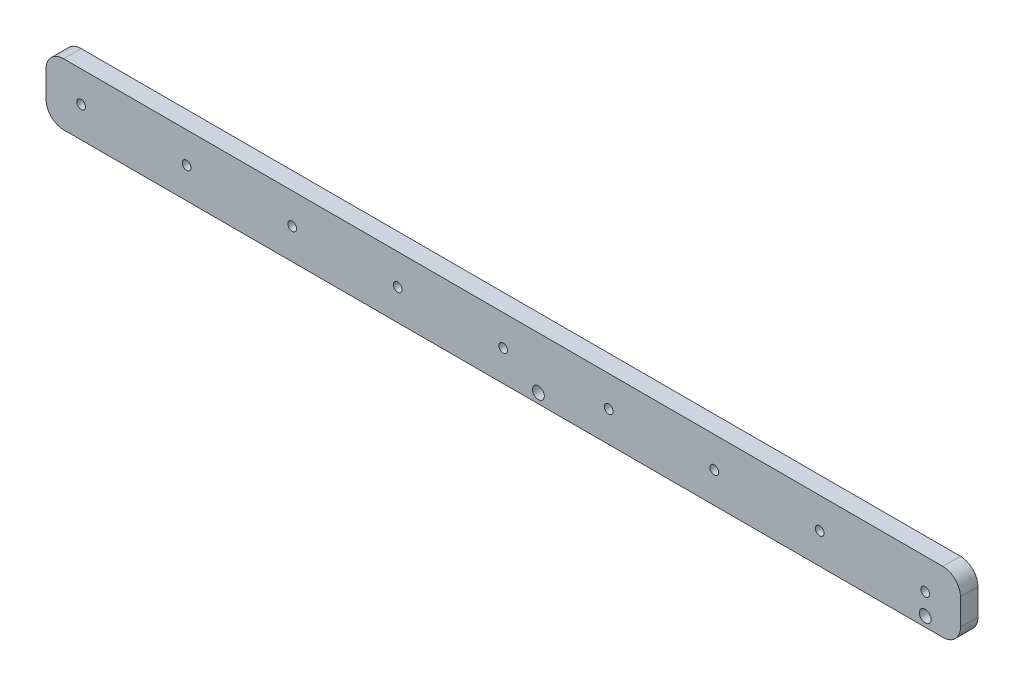
ISO-10303-21;
HEADER;
FILE_DESCRIPTION(('STEP AP214'),'2;1');
FILE_NAME('part.step','',(''),(''),'','','');
FILE_SCHEMA(('AUTOMOTIVE_DESIGN { 1 0 10303 214 1 1 1 1 }'));
ENDSEC;
DATA;
#1=APPLICATION_CONTEXT('core data for automotive mechanical design processes');
#2=APPLICATION_PROTOCOL_DEFINITION('international standard','automotive_design',2000,#1);
#3=PRODUCT_CONTEXT('',#1,'mechanical');
#4=PRODUCT('Part','Part','',(#3));
#5=PRODUCT_RELATED_PRODUCT_CATEGORY('part','',(#4));
#6=PRODUCT_DEFINITION_FORMATION('','',#4);
#7=PRODUCT_DEFINITION_CONTEXT('part definition',#1,'design');
#8=PRODUCT_DEFINITION('design','',#6,#7);
#9=PRODUCT_DEFINITION_SHAPE('','',#8);
#10=(LENGTH_UNIT() NAMED_UNIT(*) SI_UNIT(.MILLI.,.METRE.));
#11=(NAMED_UNIT(*) PLANE_ANGLE_UNIT() SI_UNIT($,.RADIAN.));
#12=(NAMED_UNIT(*) SI_UNIT($,.STERADIAN.) SOLID_ANGLE_UNIT());
#13=UNCERTAINTY_MEASURE_WITH_UNIT(LENGTH_MEASURE(1.E-05),#10,'distance_accuracy_value','');
#14=(GEOMETRIC_REPRESENTATION_CONTEXT(3) GLOBAL_UNCERTAINTY_ASSIGNED_CONTEXT((#13)) GLOBAL_UNIT_ASSIGNED_CONTEXT((#10,
#11,#12)) REPRESENTATION_CONTEXT('',''));
#15=CARTESIAN_POINT('',(0.,0.,0.));
#16=DIRECTION('',(0.,0.,1.));
#17=DIRECTION('',(1.,0.,0.));
#18=AXIS2_PLACEMENT_3D('',#15,#16,#17);
#19=CARTESIAN_POINT('',(240.,0.,10.));
#20=DIRECTION('',(0.,0.,-1.));
#21=DIRECTION('',(-1.,0.,0.));
#22=AXIS2_PLACEMENT_3D('',#19,#20,#21);
#23=CYLINDRICAL_SURFACE('',#22,7.00000000000001);
#24=CARTESIAN_POINT('',(240.,0.,0.));
#25=DIRECTION('',(0.,0.,1.));
#26=DIRECTION('',(1.,0.,0.));
#27=AXIS2_PLACEMENT_3D('',#24,#25,#26);
#28=CIRCLE('',#27,7.00000000000001);
#29=CARTESIAN_POINT('',(247.,0.,0.));
#30=VERTEX_POINT('',#29);
#31=EDGE_CURVE('E203',#30,#30,#28,.T.);
#32=ORIENTED_EDGE('',*,*,#31,.F.);
#33=EDGE_LOOP('',(#32));
#34=FACE_BOUND('',#33,.T.);
#35=CARTESIAN_POINT('',(240.,0.,6.));
#36=DIRECTION('',(0.,0.,1.));
#37=DIRECTION('',(1.,0.,0.));
#38=AXIS2_PLACEMENT_3D('',#35,#36,#37);
#39=CIRCLE('',#38,7.00000000000001);
#40=CARTESIAN_POINT('',(247.,0.,6.));
#41=VERTEX_POINT('',#40);
#42=EDGE_CURVE('E276',#41,#41,#39,.T.);
#43=ORIENTED_EDGE('',*,*,#42,.T.);
#44=EDGE_LOOP('',(#43));
#45=FACE_BOUND('',#44,.T.);
#46=ADVANCED_FACE('F33',(#34,#45),#23,.F.);
#47=CARTESIAN_POINT('',(180.,0.,10.));
#48=DIRECTION('',(0.,0.,-1.));
#49=DIRECTION('',(-1.,0.,0.));
#50=AXIS2_PLACEMENT_3D('',#47,#48,#49);
#51=CYLINDRICAL_SURFACE('',#50,7.00000000000001);
#52=CARTESIAN_POINT('',(180.,0.,0.));
#53=DIRECTION('',(0.,0.,1.));
#54=DIRECTION('',(1.,0.,0.));
#55=AXIS2_PLACEMENT_3D('',#52,#53,#54);
#56=CIRCLE('',#55,7.00000000000001);
#57=CARTESIAN_POINT('',(187.,0.,0.));
#58=VERTEX_POINT('',#57);
#59=EDGE_CURVE('E200',#58,#58,#56,.T.);
#60=ORIENTED_EDGE('',*,*,#59,.F.);
#61=EDGE_LOOP('',(#60));
#62=FACE_BOUND('',#61,.T.);
#63=CARTESIAN_POINT('',(180.,0.,6.));
#64=DIRECTION('',(0.,0.,1.));
#65=DIRECTION('',(1.,0.,0.));
#66=AXIS2_PLACEMENT_3D('',#63,#64,#65);
#67=CIRCLE('',#66,7.00000000000001);
#68=CARTESIAN_POINT('',(187.,0.,6.));
#69=VERTEX_POINT('',#68);
#70=EDGE_CURVE('E267',#69,#69,#67,.T.);
#71=ORIENTED_EDGE('',*,*,#70,.T.);
#72=EDGE_LOOP('',(#71));
#73=FACE_BOUND('',#72,.T.);
#74=ADVANCED_FACE('F327',(#62,#73),#51,.F.);
#75=CARTESIAN_POINT('',(120.,0.,10.));
#76=DIRECTION('',(0.,0.,-1.));
#77=DIRECTION('',(-1.,0.,0.));
#78=AXIS2_PLACEMENT_3D('',#75,#76,#77);
#79=CYLINDRICAL_SURFACE('',#78,7.00000000000001);
#80=CARTESIAN_POINT('',(120.,0.,0.));
#81=DIRECTION('',(0.,0.,1.));
#82=DIRECTION('',(1.,0.,0.));
#83=AXIS2_PLACEMENT_3D('',#80,#81,#82);
#84=CIRCLE('',#83,7.00000000000001);
#85=CARTESIAN_POINT('',(127.,0.,0.));
#86=VERTEX_POINT('',#85);
#87=EDGE_CURVE('E197',#86,#86,#84,.T.);
#88=ORIENTED_EDGE('',*,*,#87,.F.);
#89=EDGE_LOOP('',(#88));
#90=FACE_BOUND('',#89,.T.);
#91=CARTESIAN_POINT('',(120.,0.,6.));
#92=DIRECTION('',(0.,0.,1.));
#93=DIRECTION('',(1.,0.,0.));
#94=AXIS2_PLACEMENT_3D('',#91,#92,#93);
#95=CIRCLE('',#94,7.00000000000001);
#96=CARTESIAN_POINT('',(127.,0.,6.));
#97=VERTEX_POINT('',#96);
#98=EDGE_CURVE('E258',#97,#97,#95,.T.);
#99=ORIENTED_EDGE('',*,*,#98,.T.);
#100=EDGE_LOOP('',(#99));
#101=FACE_BOUND('',#100,.T.);
#102=ADVANCED_FACE('F333',(#90,#101),#79,.F.);
#103=CARTESIAN_POINT('',(60.0000000000001,0.,10.));
#104=DIRECTION('',(0.,0.,-1.));
#105=DIRECTION('',(-1.,0.,0.));
#106=AXIS2_PLACEMENT_3D('',#103,#104,#105);
#107=CYLINDRICAL_SURFACE('',#106,7.);
#108=CARTESIAN_POINT('',(60.0000000000001,0.,0.));
#109=DIRECTION('',(0.,0.,1.));
#110=DIRECTION('',(1.,0.,0.));
#111=AXIS2_PLACEMENT_3D('',#108,#109,#110);
#112=CIRCLE('',#111,7.);
#113=CARTESIAN_POINT('',(67.0000000000001,0.,0.));
#114=VERTEX_POINT('',#113);
#115=EDGE_CURVE('E194',#114,#114,#112,.T.);
#116=ORIENTED_EDGE('',*,*,#115,.F.);
#117=EDGE_LOOP('',(#116));
#118=FACE_BOUND('',#117,.T.);
#119=CARTESIAN_POINT('',(60.0000000000001,0.,6.));
#120=DIRECTION('',(0.,0.,1.));
#121=DIRECTION('',(1.,0.,0.));
#122=AXIS2_PLACEMENT_3D('',#119,#120,#121);
#123=CIRCLE('',#122,7.00000000000002);
#124=CARTESIAN_POINT('',(67.0000000000001,0.,6.));
#125=VERTEX_POINT('',#124);
#126=EDGE_CURVE('E249',#125,#125,#123,.T.);
#127=ORIENTED_EDGE('',*,*,#126,.T.);
#128=EDGE_LOOP('',(#127));
#129=FACE_BOUND('',#128,.T.);
#130=ADVANCED_FACE('F344',(#118,#129),#107,.F.);
#131=CARTESIAN_POINT('',(0.,0.,10.));
#132=DIRECTION('',(0.,0.,-1.));
#133=DIRECTION('',(-1.,0.,0.));
#134=AXIS2_PLACEMENT_3D('',#131,#132,#133);
#135=CYLINDRICAL_SURFACE('',#134,7.);
#136=CARTESIAN_POINT('',(0.,0.,0.));
#137=DIRECTION('',(0.,0.,1.));
#138=DIRECTION('',(1.,0.,0.));
#139=AXIS2_PLACEMENT_3D('',#136,#137,#138);
#140=CIRCLE('',#139,7.);
#141=CARTESIAN_POINT('',(7.00000000000006,0.,0.));
#142=VERTEX_POINT('',#141);
#143=EDGE_CURVE('E191',#142,#142,#140,.T.);
#144=ORIENTED_EDGE('',*,*,#143,.F.);
#145=EDGE_LOOP('',(#144));
#146=FACE_BOUND('',#145,.T.);
#147=CARTESIAN_POINT('',(0.,0.,6.));
#148=DIRECTION('',(0.,0.,1.));
#149=DIRECTION('',(1.,0.,0.));
#150=AXIS2_PLACEMENT_3D('',#147,#148,#149);
#151=CIRCLE('',#150,7.00000000000002);
#152=CARTESIAN_POINT('',(7.00000000000007,0.,6.));
#153=VERTEX_POINT('',#152);
#154=EDGE_CURVE('E240',#153,#153,#151,.T.);
#155=ORIENTED_EDGE('',*,*,#154,.T.);
#156=EDGE_LOOP('',(#155));
#157=FACE_BOUND('',#156,.T.);
#158=ADVANCED_FACE('F348',(#146,#157),#135,.F.);
#159=CARTESIAN_POINT('',(-59.9999999999999,0.,10.));
#160=DIRECTION('',(0.,0.,-1.));
#161=DIRECTION('',(-1.,0.,0.));
#162=AXIS2_PLACEMENT_3D('',#159,#160,#161);
#163=CYLINDRICAL_SURFACE('',#162,7.00000000000001);
#164=CARTESIAN_POINT('',(-59.9999999999999,0.,0.));
#165=DIRECTION('',(0.,0.,1.));
#166=DIRECTION('',(1.,0.,0.));
#167=AXIS2_PLACEMENT_3D('',#164,#165,#166);
#168=CIRCLE('',#167,7.00000000000001);
#169=CARTESIAN_POINT('',(-52.9999999999999,0.,0.));
#170=VERTEX_POINT('',#169);
#171=EDGE_CURVE('E188',#170,#170,#168,.T.);
#172=ORIENTED_EDGE('',*,*,#171,.F.);
#173=EDGE_LOOP('',(#172));
#174=FACE_BOUND('',#173,.T.);
#175=CARTESIAN_POINT('',(-59.9999999999999,0.,6.));
#176=DIRECTION('',(0.,0.,1.));
#177=DIRECTION('',(1.,0.,0.));
#178=AXIS2_PLACEMENT_3D('',#175,#176,#177);
#179=CIRCLE('',#178,7.00000000000001);
#180=CARTESIAN_POINT('',(-52.9999999999999,0.,6.));
#181=VERTEX_POINT('',#180);
#182=EDGE_CURVE('E231',#181,#181,#179,.T.);
#183=ORIENTED_EDGE('',*,*,#182,.T.);
#184=EDGE_LOOP('',(#183));
#185=FACE_BOUND('',#184,.T.);
#186=ADVANCED_FACE('F352',(#174,#185),#163,.F.);
#187=CARTESIAN_POINT('',(-120.,0.,10.));
#188=DIRECTION('',(0.,0.,-1.));
#189=DIRECTION('',(-1.,0.,0.));
#190=AXIS2_PLACEMENT_3D('',#187,#188,#189);
#191=CYLINDRICAL_SURFACE('',#190,7.00000000000002);
#192=CARTESIAN_POINT('',(-120.,0.,0.));
#193=DIRECTION('',(0.,0.,1.));
#194=DIRECTION('',(1.,0.,0.));
#195=AXIS2_PLACEMENT_3D('',#192,#193,#194);
#196=CIRCLE('',#195,7.00000000000002);
#197=CARTESIAN_POINT('',(-113.,0.,0.));
#198=VERTEX_POINT('',#197);
#199=EDGE_CURVE('E185',#198,#198,#196,.T.);
#200=ORIENTED_EDGE('',*,*,#199,.F.);
#201=EDGE_LOOP('',(#200));
#202=FACE_BOUND('',#201,.T.);
#203=CARTESIAN_POINT('',(-120.,0.,6.));
#204=DIRECTION('',(0.,0.,1.));
#205=DIRECTION('',(1.,0.,0.));
#206=AXIS2_PLACEMENT_3D('',#203,#204,#205);
#207=CIRCLE('',#206,7.00000000000002);
#208=CARTESIAN_POINT('',(-113.,0.,6.));
#209=VERTEX_POINT('',#208);
#210=EDGE_CURVE('E222',#209,#209,#207,.T.);
#211=ORIENTED_EDGE('',*,*,#210,.T.);
#212=EDGE_LOOP('',(#211));
#213=FACE_BOUND('',#212,.T.);
#214=ADVANCED_FACE('F356',(#202,#213),#191,.F.);
#215=CARTESIAN_POINT('',(-180.,0.,10.));
#216=DIRECTION('',(0.,0.,-1.));
#217=DIRECTION('',(-1.,0.,0.));
#218=AXIS2_PLACEMENT_3D('',#215,#216,#217);
#219=CYLINDRICAL_SURFACE('',#218,7.00000000000001);
#220=CARTESIAN_POINT('',(-180.,0.,0.));
#221=DIRECTION('',(0.,0.,1.));
#222=DIRECTION('',(1.,0.,0.));
#223=AXIS2_PLACEMENT_3D('',#220,#221,#222);
#224=CIRCLE('',#223,7.00000000000001);
#225=CARTESIAN_POINT('',(-173.,0.,0.));
#226=VERTEX_POINT('',#225);
#227=EDGE_CURVE('E182',#226,#226,#224,.T.);
#228=ORIENTED_EDGE('',*,*,#227,.F.);
#229=EDGE_LOOP('',(#228));
#230=FACE_BOUND('',#229,.T.);
#231=CARTESIAN_POINT('',(-180.,0.,6.));
#232=DIRECTION('',(0.,0.,1.));
#233=DIRECTION('',(1.,0.,0.));
#234=AXIS2_PLACEMENT_3D('',#231,#232,#233);
#235=CIRCLE('',#234,7.00000000000001);
#236=CARTESIAN_POINT('',(-173.,0.,6.));
#237=VERTEX_POINT('',#236);
#238=EDGE_CURVE('E213',#237,#237,#235,.T.);
#239=ORIENTED_EDGE('',*,*,#238,.T.);
#240=EDGE_LOOP('',(#239));
#241=FACE_BOUND('',#240,.T.);
#242=ADVANCED_FACE('F360',(#230,#241),#219,.F.);
#243=CARTESIAN_POINT('',(-240.,0.,10.));
#244=DIRECTION('',(0.,0.,-1.));
#245=DIRECTION('',(-1.,0.,0.));
#246=AXIS2_PLACEMENT_3D('',#243,#244,#245);
#247=CYLINDRICAL_SURFACE('',#246,7.00000000000001);
#248=CARTESIAN_POINT('',(-240.,0.,0.));
#249=DIRECTION('',(0.,0.,1.));
#250=DIRECTION('',(1.,0.,0.));
#251=AXIS2_PLACEMENT_3D('',#248,#249,#250);
#252=CIRCLE('',#251,7.00000000000001);
#253=CARTESIAN_POINT('',(-233.,0.,0.));
#254=VERTEX_POINT('',#253);
#255=EDGE_CURVE('E135',#254,#254,#252,.T.);
#256=ORIENTED_EDGE('',*,*,#255,.F.);
#257=EDGE_LOOP('',(#256));
#258=FACE_BOUND('',#257,.T.);
#259=CARTESIAN_POINT('',(-240.,0.,6.));
#260=DIRECTION('',(0.,0.,1.));
#261=DIRECTION('',(1.,0.,0.));
#262=AXIS2_PLACEMENT_3D('',#259,#260,#261);
#263=CIRCLE('',#262,7.00000000000001);
#264=CARTESIAN_POINT('',(-233.,0.,6.));
#265=VERTEX_POINT('',#264);
#266=EDGE_CURVE('E206',#265,#265,#263,.T.);
#267=ORIENTED_EDGE('',*,*,#266,.T.);
#268=EDGE_LOOP('',(#267));
#269=FACE_BOUND('',#268,.T.);
#270=ADVANCED_FACE('F311',(#258,#269),#247,.F.);
#271=CARTESIAN_POINT('',(250.,-7.5,10.));
#272=DIRECTION('',(0.,0.,1.));
#273=DIRECTION('',(1.,0.,0.));
#274=AXIS2_PLACEMENT_3D('',#271,#272,#273);
#275=PLANE('',#274);
#276=CARTESIAN_POINT('',(240.000000156462,-12.0000003129244,10.));
#277=DIRECTION('',(0.,0.,1.));
#278=DIRECTION('',(1.,0.,0.));
#279=AXIS2_PLACEMENT_3D('',#276,#277,#278);
#280=CIRCLE('',#279,3.37499999999999);
#281=CARTESIAN_POINT('',(243.375000156462,-12.0000003129244,10.));
#282=VERTEX_POINT('',#281);
#283=EDGE_CURVE('E294',#282,#282,#280,.T.);
#284=ORIENTED_EDGE('',*,*,#283,.F.);
#285=EDGE_LOOP('',(#284));
#286=FACE_BOUND('',#285,.T.);
#287=CARTESIAN_POINT('',(20.0000001564622,-12.0000003129244,10.));
#288=DIRECTION('',(0.,0.,1.));
#289=DIRECTION('',(1.,0.,0.));
#290=AXIS2_PLACEMENT_3D('',#287,#288,#289);
#291=CIRCLE('',#290,3.37499999999996);
#292=CARTESIAN_POINT('',(23.3750001564622,-12.0000003129244,10.));
#293=VERTEX_POINT('',#292);
#294=EDGE_CURVE('E288',#293,#293,#291,.T.);
#295=ORIENTED_EDGE('',*,*,#294,.F.);
#296=EDGE_LOOP('',(#295));
#297=FACE_BOUND('',#296,.T.);
#298=CARTESIAN_POINT('',(250.,-7.5,10.));
#299=DIRECTION('',(0.,0.,1.));
#300=DIRECTION('',(1.,0.,0.));
#301=AXIS2_PLACEMENT_3D('',#298,#299,#300);
#302=CIRCLE('',#301,10.);
#303=CARTESIAN_POINT('',(250.,-17.5,10.));
#304=VERTEX_POINT('',#303);
#305=CARTESIAN_POINT('',(260.,-7.5,10.));
#306=VERTEX_POINT('',#305);
#307=EDGE_CURVE('E146',#304,#306,#302,.T.);
#308=ORIENTED_EDGE('',*,*,#307,.T.);
#309=DIRECTION('',(0.,1.,0.));
#310=VECTOR('',#309,1.);
#311=CARTESIAN_POINT('',(260.,7.5,10.));
#312=LINE('',#311,#310);
#313=CARTESIAN_POINT('',(260.,7.5,10.));
#314=VERTEX_POINT('',#313);
#315=EDGE_CURVE('E93',#306,#314,#312,.T.);
#316=ORIENTED_EDGE('',*,*,#315,.T.);
#317=CARTESIAN_POINT('',(250.,7.5,10.));
#318=DIRECTION('',(0.,0.,1.));
#319=DIRECTION('',(-1.,0.,0.));
#320=AXIS2_PLACEMENT_3D('',#317,#318,#319);
#321=CIRCLE('',#320,10.);
#322=CARTESIAN_POINT('',(250.,17.5,10.));
#323=VERTEX_POINT('',#322);
#324=EDGE_CURVE('E161',#314,#323,#321,.T.);
#325=ORIENTED_EDGE('',*,*,#324,.T.);
#326=DIRECTION('',(-1.,0.,0.));
#327=VECTOR('',#326,1.);
#328=CARTESIAN_POINT('',(-250.,17.5,10.));
#329=LINE('',#328,#327);
#330=CARTESIAN_POINT('',(-250.,17.5,10.));
#331=VERTEX_POINT('',#330);
#332=EDGE_CURVE('E174',#323,#331,#329,.T.);
#333=ORIENTED_EDGE('',*,*,#332,.T.);
#334=CARTESIAN_POINT('',(-250.,7.5,10.));
#335=DIRECTION('',(0.,0.,1.));
#336=DIRECTION('',(1.,0.,0.));
#337=AXIS2_PLACEMENT_3D('',#334,#335,#336);
#338=CIRCLE('',#337,10.);
#339=CARTESIAN_POINT('',(-260.,7.5,10.));
#340=VERTEX_POINT('',#339);
#341=EDGE_CURVE('E113',#331,#340,#338,.T.);
#342=ORIENTED_EDGE('',*,*,#341,.T.);
#343=DIRECTION('',(0.,-1.,0.));
#344=VECTOR('',#343,1.);
#345=CARTESIAN_POINT('',(-260.,7.5,10.));
#346=LINE('',#345,#344);
#347=CARTESIAN_POINT('',(-260.,-7.5,10.));
#348=VERTEX_POINT('',#347);
#349=EDGE_CURVE('E106',#340,#348,#346,.T.);
#350=ORIENTED_EDGE('',*,*,#349,.T.);
#351=CARTESIAN_POINT('',(-250.,-7.5,10.));
#352=DIRECTION('',(0.,0.,1.));
#353=DIRECTION('',(1.,0.,0.));
#354=AXIS2_PLACEMENT_3D('',#351,#352,#353);
#355=CIRCLE('',#354,10.);
#356=CARTESIAN_POINT('',(-250.,-17.5,10.));
#357=VERTEX_POINT('',#356);
#358=EDGE_CURVE('E111',#348,#357,#355,.T.);
#359=ORIENTED_EDGE('',*,*,#358,.T.);
#360=DIRECTION('',(1.,0.,0.));
#361=VECTOR('',#360,1.);
#362=CARTESIAN_POINT('',(-250.,-17.5,10.));
#363=LINE('',#362,#361);
#364=EDGE_CURVE('E50',#357,#304,#363,.T.);
#365=ORIENTED_EDGE('',*,*,#364,.T.);
#366=EDGE_LOOP('',(#308,#316,#325,#333,#342,#350,#359,#365));
#367=FACE_BOUND('',#366,.T.);
#368=CARTESIAN_POINT('',(-240.,0.,10.));
#369=DIRECTION('',(0.,0.,1.));
#370=DIRECTION('',(1.,0.,0.));
#371=AXIS2_PLACEMENT_3D('',#368,#369,#370);
#372=CIRCLE('',#371,2.5);
#373=CARTESIAN_POINT('',(-237.5,0.,10.));
#374=VERTEX_POINT('',#373);
#375=EDGE_CURVE('E210',#374,#374,#372,.T.);
#376=ORIENTED_EDGE('',*,*,#375,.F.);
#377=EDGE_LOOP('',(#376));
#378=FACE_BOUND('',#377,.T.);
#379=CARTESIAN_POINT('',(-180.,0.,10.));
#380=DIRECTION('',(0.,0.,1.));
#381=DIRECTION('',(1.,0.,0.));
#382=AXIS2_PLACEMENT_3D('',#379,#380,#381);
#383=CIRCLE('',#382,2.5);
#384=CARTESIAN_POINT('',(-177.5,0.,10.));
#385=VERTEX_POINT('',#384);
#386=EDGE_CURVE('E219',#385,#385,#383,.T.);
#387=ORIENTED_EDGE('',*,*,#386,.F.);
#388=EDGE_LOOP('',(#387));
#389=FACE_BOUND('',#388,.T.);
#390=CARTESIAN_POINT('',(-120.,0.,10.));
#391=DIRECTION('',(0.,0.,1.));
#392=DIRECTION('',(1.,0.,0.));
#393=AXIS2_PLACEMENT_3D('',#390,#391,#392);
#394=CIRCLE('',#393,2.5);
#395=CARTESIAN_POINT('',(-117.5,0.,10.));
#396=VERTEX_POINT('',#395);
#397=EDGE_CURVE('E228',#396,#396,#394,.T.);
#398=ORIENTED_EDGE('',*,*,#397,.F.);
#399=EDGE_LOOP('',(#398));
#400=FACE_BOUND('',#399,.T.);
#401=CARTESIAN_POINT('',(-59.9999999999999,0.,10.));
#402=DIRECTION('',(0.,0.,1.));
#403=DIRECTION('',(1.,0.,0.));
#404=AXIS2_PLACEMENT_3D('',#401,#402,#403);
#405=CIRCLE('',#404,2.49999999999999);
#406=CARTESIAN_POINT('',(-57.5,0.,10.));
#407=VERTEX_POINT('',#406);
#408=EDGE_CURVE('E237',#407,#407,#405,.T.);
#409=ORIENTED_EDGE('',*,*,#408,.F.);
#410=EDGE_LOOP('',(#409));
#411=FACE_BOUND('',#410,.T.);
#412=CARTESIAN_POINT('',(0.,0.,10.));
#413=DIRECTION('',(0.,0.,1.));
#414=DIRECTION('',(1.,0.,0.));
#415=AXIS2_PLACEMENT_3D('',#412,#413,#414);
#416=CIRCLE('',#415,2.5);
#417=CARTESIAN_POINT('',(2.50000000000005,0.,10.));
#418=VERTEX_POINT('',#417);
#419=EDGE_CURVE('E246',#418,#418,#416,.T.);
#420=ORIENTED_EDGE('',*,*,#419,.F.);
#421=EDGE_LOOP('',(#420));
#422=FACE_BOUND('',#421,.T.);
#423=CARTESIAN_POINT('',(60.0000000000001,0.,10.));
#424=DIRECTION('',(0.,0.,1.));
#425=DIRECTION('',(1.,0.,0.));
#426=AXIS2_PLACEMENT_3D('',#423,#424,#425);
#427=CIRCLE('',#426,2.5);
#428=CARTESIAN_POINT('',(62.5000000000001,0.,10.));
#429=VERTEX_POINT('',#428);
#430=EDGE_CURVE('E255',#429,#429,#427,.T.);
#431=ORIENTED_EDGE('',*,*,#430,.F.);
#432=EDGE_LOOP('',(#431));
#433=FACE_BOUND('',#432,.T.);
#434=CARTESIAN_POINT('',(120.,0.,10.));
#435=DIRECTION('',(0.,0.,1.));
#436=DIRECTION('',(1.,0.,0.));
#437=AXIS2_PLACEMENT_3D('',#434,#435,#436);
#438=CIRCLE('',#437,2.49999999999999);
#439=CARTESIAN_POINT('',(122.5,0.,10.));
#440=VERTEX_POINT('',#439);
#441=EDGE_CURVE('E264',#440,#440,#438,.T.);
#442=ORIENTED_EDGE('',*,*,#441,.F.);
#443=EDGE_LOOP('',(#442));
#444=FACE_BOUND('',#443,.T.);
#445=CARTESIAN_POINT('',(180.,0.,10.));
#446=DIRECTION('',(0.,0.,1.));
#447=DIRECTION('',(1.,0.,0.));
#448=AXIS2_PLACEMENT_3D('',#445,#446,#447);
#449=CIRCLE('',#448,2.5);
#450=CARTESIAN_POINT('',(182.5,0.,10.));
#451=VERTEX_POINT('',#450);
#452=EDGE_CURVE('E273',#451,#451,#449,.T.);
#453=ORIENTED_EDGE('',*,*,#452,.F.);
#454=EDGE_LOOP('',(#453));
#455=FACE_BOUND('',#454,.T.);
#456=CARTESIAN_POINT('',(240.,0.,10.));
#457=DIRECTION('',(0.,0.,1.));
#458=DIRECTION('',(1.,0.,0.));
#459=AXIS2_PLACEMENT_3D('',#456,#457,#458);
#460=CIRCLE('',#459,2.5);
#461=CARTESIAN_POINT('',(242.5,0.,10.));
#462=VERTEX_POINT('',#461);
#463=EDGE_CURVE('E282',#462,#462,#460,.T.);
#464=ORIENTED_EDGE('',*,*,#463,.F.);
#465=EDGE_LOOP('',(#464));
#466=FACE_BOUND('',#465,.T.);
#467=ADVANCED_FACE('F108',(#286,#297,#367,#378,#389,#400,#411,#422,#433,#444,#455,#466),#275,.T.);
#468=CARTESIAN_POINT('',(250.,-7.5,0.));
#469=DIRECTION('',(0.,0.,1.));
#470=DIRECTION('',(1.,0.,0.));
#471=AXIS2_PLACEMENT_3D('',#468,#469,#470);
#472=PLANE('',#471);
#473=CARTESIAN_POINT('',(240.000000156462,-12.0000003129244,0.));
#474=DIRECTION('',(0.,0.,1.));
#475=DIRECTION('',(1.,0.,0.));
#476=AXIS2_PLACEMENT_3D('',#473,#474,#475);
#477=CIRCLE('',#476,3.37499999999999);
#478=CARTESIAN_POINT('',(243.375000156462,-12.0000003129244,0.));
#479=VERTEX_POINT('',#478);
#480=EDGE_CURVE('E291',#479,#479,#477,.T.);
#481=ORIENTED_EDGE('',*,*,#480,.T.);
#482=EDGE_LOOP('',(#481));
#483=FACE_BOUND('',#482,.T.);
#484=CARTESIAN_POINT('',(20.0000001564622,-12.0000003129244,0.));
#485=DIRECTION('',(0.,0.,1.));
#486=DIRECTION('',(1.,0.,0.));
#487=AXIS2_PLACEMENT_3D('',#484,#485,#486);
#488=CIRCLE('',#487,3.37499999999996);
#489=CARTESIAN_POINT('',(23.3750001564622,-12.0000003129244,0.));
#490=VERTEX_POINT('',#489);
#491=EDGE_CURVE('E285',#490,#490,#488,.T.);
#492=ORIENTED_EDGE('',*,*,#491,.T.);
#493=EDGE_LOOP('',(#492));
#494=FACE_BOUND('',#493,.T.);
#495=CARTESIAN_POINT('',(250.,-7.5,0.));
#496=DIRECTION('',(0.,0.,1.));
#497=DIRECTION('',(1.,0.,0.));
#498=AXIS2_PLACEMENT_3D('',#495,#496,#497);
#499=CIRCLE('',#498,10.);
#500=CARTESIAN_POINT('',(250.,-17.5,0.));
#501=VERTEX_POINT('',#500);
#502=CARTESIAN_POINT('',(260.,-7.5,0.));
#503=VERTEX_POINT('',#502);
#504=EDGE_CURVE('E131',#501,#503,#499,.T.);
#505=ORIENTED_EDGE('',*,*,#504,.F.);
#506=DIRECTION('',(1.,0.,0.));
#507=VECTOR('',#506,1.);
#508=CARTESIAN_POINT('',(-250.,-17.5,0.));
#509=LINE('',#508,#507);
#510=CARTESIAN_POINT('',(-250.,-17.5,0.));
#511=VERTEX_POINT('',#510);
#512=EDGE_CURVE('E85',#511,#501,#509,.T.);
#513=ORIENTED_EDGE('',*,*,#512,.F.);
#514=CARTESIAN_POINT('',(-250.,-7.5,0.));
#515=DIRECTION('',(0.,0.,1.));
#516=DIRECTION('',(1.,0.,0.));
#517=AXIS2_PLACEMENT_3D('',#514,#515,#516);
#518=CIRCLE('',#517,10.);
#519=CARTESIAN_POINT('',(-260.,-7.5,0.));
#520=VERTEX_POINT('',#519);
#521=EDGE_CURVE('E79',#520,#511,#518,.T.);
#522=ORIENTED_EDGE('',*,*,#521,.F.);
#523=DIRECTION('',(0.,-1.,0.));
#524=VECTOR('',#523,1.);
#525=CARTESIAN_POINT('',(-260.,7.5,0.));
#526=LINE('',#525,#524);
#527=CARTESIAN_POINT('',(-260.,7.5,0.));
#528=VERTEX_POINT('',#527);
#529=EDGE_CURVE('E121',#528,#520,#526,.T.);
#530=ORIENTED_EDGE('',*,*,#529,.F.);
#531=CARTESIAN_POINT('',(-250.,7.5,0.));
#532=DIRECTION('',(0.,0.,1.));
#533=DIRECTION('',(1.,0.,0.));
#534=AXIS2_PLACEMENT_3D('',#531,#532,#533);
#535=CIRCLE('',#534,10.);
#536=CARTESIAN_POINT('',(-250.,17.5,0.));
#537=VERTEX_POINT('',#536);
#538=EDGE_CURVE('E141',#537,#528,#535,.T.);
#539=ORIENTED_EDGE('',*,*,#538,.F.);
#540=DIRECTION('',(-1.,0.,0.));
#541=VECTOR('',#540,1.);
#542=CARTESIAN_POINT('',(-250.,17.5,0.));
#543=LINE('',#542,#541);
#544=CARTESIAN_POINT('',(250.,17.5,0.));
#545=VERTEX_POINT('',#544);
#546=EDGE_CURVE('E139',#545,#537,#543,.T.);
#547=ORIENTED_EDGE('',*,*,#546,.F.);
#548=CARTESIAN_POINT('',(250.,7.5,0.));
#549=DIRECTION('',(0.,0.,1.));
#550=DIRECTION('',(-1.,0.,0.));
#551=AXIS2_PLACEMENT_3D('',#548,#549,#550);
#552=CIRCLE('',#551,10.);
#553=CARTESIAN_POINT('',(260.,7.5,0.));
#554=VERTEX_POINT('',#553);
#555=EDGE_CURVE('E137',#554,#545,#552,.T.);
#556=ORIENTED_EDGE('',*,*,#555,.F.);
#557=DIRECTION('',(0.,1.,0.));
#558=VECTOR('',#557,1.);
#559=CARTESIAN_POINT('',(260.,7.5,0.));
#560=LINE('',#559,#558);
#561=EDGE_CURVE('E134',#503,#554,#560,.T.);
#562=ORIENTED_EDGE('',*,*,#561,.F.);
#563=EDGE_LOOP('',(#505,#513,#522,#530,#539,#547,#556,#562));
#564=FACE_BOUND('',#563,.T.);
#565=ORIENTED_EDGE('',*,*,#255,.T.);
#566=EDGE_LOOP('',(#565));
#567=FACE_BOUND('',#566,.T.);
#568=ORIENTED_EDGE('',*,*,#227,.T.);
#569=EDGE_LOOP('',(#568));
#570=FACE_BOUND('',#569,.T.);
#571=ORIENTED_EDGE('',*,*,#199,.T.);
#572=EDGE_LOOP('',(#571));
#573=FACE_BOUND('',#572,.T.);
#574=ORIENTED_EDGE('',*,*,#171,.T.);
#575=EDGE_LOOP('',(#574));
#576=FACE_BOUND('',#575,.T.);
#577=ORIENTED_EDGE('',*,*,#143,.T.);
#578=EDGE_LOOP('',(#577));
#579=FACE_BOUND('',#578,.T.);
#580=ORIENTED_EDGE('',*,*,#115,.T.);
#581=EDGE_LOOP('',(#580));
#582=FACE_BOUND('',#581,.T.);
#583=ORIENTED_EDGE('',*,*,#87,.T.);
#584=EDGE_LOOP('',(#583));
#585=FACE_BOUND('',#584,.T.);
#586=ORIENTED_EDGE('',*,*,#59,.T.);
#587=EDGE_LOOP('',(#586));
#588=FACE_BOUND('',#587,.T.);
#589=ORIENTED_EDGE('',*,*,#31,.T.);
#590=EDGE_LOOP('',(#589));
#591=FACE_BOUND('',#590,.T.);
#592=ADVANCED_FACE('F165',(#483,#494,#564,#567,#570,#573,#576,#579,#582,#585,#588,#591),#472,.F.);
#593=CARTESIAN_POINT('',(250.,-7.5,10.));
#594=DIRECTION('',(0.,0.,-1.));
#595=DIRECTION('',(-1.,0.,0.));
#596=AXIS2_PLACEMENT_3D('',#593,#594,#595);
#597=CYLINDRICAL_SURFACE('',#596,10.);
#598=ORIENTED_EDGE('',*,*,#504,.T.);
#599=DIRECTION('',(0.,0.,-1.));
#600=VECTOR('',#599,1.);
#601=CARTESIAN_POINT('',(260.,-7.5,10.));
#602=LINE('',#601,#600);
#603=EDGE_CURVE('E11',#306,#503,#602,.T.);
#604=ORIENTED_EDGE('',*,*,#603,.F.);
#605=ORIENTED_EDGE('',*,*,#307,.F.);
#606=DIRECTION('',(0.,0.,-1.));
#607=VECTOR('',#606,1.);
#608=CARTESIAN_POINT('',(250.,-17.5,10.));
#609=LINE('',#608,#607);
#610=EDGE_CURVE('E127',#304,#501,#609,.T.);
#611=ORIENTED_EDGE('',*,*,#610,.T.);
#612=EDGE_LOOP('',(#598,#604,#605,#611));
#613=FACE_BOUND('',#612,.T.);
#614=ADVANCED_FACE('F35',(#613),#597,.T.);
#615=CARTESIAN_POINT('',(260.,7.5,10.));
#616=DIRECTION('',(-1.,0.,0.));
#617=DIRECTION('',(0.,0.,1.));
#618=AXIS2_PLACEMENT_3D('',#615,#616,#617);
#619=PLANE('',#618);
#620=ORIENTED_EDGE('',*,*,#561,.T.);
#621=DIRECTION('',(0.,0.,-1.));
#622=VECTOR('',#621,1.);
#623=CARTESIAN_POINT('',(260.,7.5,10.));
#624=LINE('',#623,#622);
#625=EDGE_CURVE('E42',#314,#554,#624,.T.);
#626=ORIENTED_EDGE('',*,*,#625,.F.);
#627=ORIENTED_EDGE('',*,*,#315,.F.);
#628=ORIENTED_EDGE('',*,*,#603,.T.);
#629=EDGE_LOOP('',(#620,#626,#627,#628));
#630=FACE_BOUND('',#629,.T.);
#631=ADVANCED_FACE('F382',(#630),#619,.F.);
#632=CARTESIAN_POINT('',(250.,7.5,10.));
#633=DIRECTION('',(0.,0.,-1.));
#634=DIRECTION('',(-1.,0.,0.));
#635=AXIS2_PLACEMENT_3D('',#632,#633,#634);
#636=CYLINDRICAL_SURFACE('',#635,10.);
#637=ORIENTED_EDGE('',*,*,#555,.T.);
#638=DIRECTION('',(0.,0.,-1.));
#639=VECTOR('',#638,1.);
#640=CARTESIAN_POINT('',(250.,17.5,10.));
#641=LINE('',#640,#639);
#642=EDGE_CURVE('E153',#323,#545,#641,.T.);
#643=ORIENTED_EDGE('',*,*,#642,.F.);
#644=ORIENTED_EDGE('',*,*,#324,.F.);
#645=ORIENTED_EDGE('',*,*,#625,.T.);
#646=EDGE_LOOP('',(#637,#643,#644,#645));
#647=FACE_BOUND('',#646,.T.);
#648=ADVANCED_FACE('F159',(#647),#636,.T.);
#649=CARTESIAN_POINT('',(-250.,17.5,10.));
#650=DIRECTION('',(0.,-1.,0.));
#651=DIRECTION('',(0.,0.,-1.));
#652=AXIS2_PLACEMENT_3D('',#649,#650,#651);
#653=PLANE('',#652);
#654=ORIENTED_EDGE('',*,*,#546,.T.);
#655=DIRECTION('',(0.,0.,-1.));
#656=VECTOR('',#655,1.);
#657=CARTESIAN_POINT('',(-250.,17.5,10.));
#658=LINE('',#657,#656);
#659=EDGE_CURVE('E150',#331,#537,#658,.T.);
#660=ORIENTED_EDGE('',*,*,#659,.F.);
#661=ORIENTED_EDGE('',*,*,#332,.F.);
#662=ORIENTED_EDGE('',*,*,#642,.T.);
#663=EDGE_LOOP('',(#654,#660,#661,#662));
#664=FACE_BOUND('',#663,.T.);
#665=ADVANCED_FACE('F170',(#664),#653,.F.);
#666=CARTESIAN_POINT('',(-250.,7.5,10.));
#667=DIRECTION('',(0.,0.,-1.));
#668=DIRECTION('',(-1.,0.,0.));
#669=AXIS2_PLACEMENT_3D('',#666,#667,#668);
#670=CYLINDRICAL_SURFACE('',#669,10.);
#671=ORIENTED_EDGE('',*,*,#538,.T.);
#672=DIRECTION('',(0.,0.,-1.));
#673=VECTOR('',#672,1.);
#674=CARTESIAN_POINT('',(-260.,7.5,10.));
#675=LINE('',#674,#673);
#676=EDGE_CURVE('E122',#340,#528,#675,.T.);
#677=ORIENTED_EDGE('',*,*,#676,.F.);
#678=ORIENTED_EDGE('',*,*,#341,.F.);
#679=ORIENTED_EDGE('',*,*,#659,.T.);
#680=EDGE_LOOP('',(#671,#677,#678,#679));
#681=FACE_BOUND('',#680,.T.);
#682=ADVANCED_FACE('F173',(#681),#670,.T.);
#683=CARTESIAN_POINT('',(-260.,7.5,10.));
#684=DIRECTION('',(1.,0.,0.));
#685=DIRECTION('',(0.,0.,-1.));
#686=AXIS2_PLACEMENT_3D('',#683,#684,#685);
#687=PLANE('',#686);
#688=ORIENTED_EDGE('',*,*,#529,.T.);
#689=DIRECTION('',(0.,0.,-1.));
#690=VECTOR('',#689,1.);
#691=CARTESIAN_POINT('',(-260.,-7.5,10.));
#692=LINE('',#691,#690);
#693=EDGE_CURVE('E118',#348,#520,#692,.T.);
#694=ORIENTED_EDGE('',*,*,#693,.F.);
#695=ORIENTED_EDGE('',*,*,#349,.F.);
#696=ORIENTED_EDGE('',*,*,#676,.T.);
#697=EDGE_LOOP('',(#688,#694,#695,#696));
#698=FACE_BOUND('',#697,.T.);
#699=ADVANCED_FACE('F119',(#698),#687,.F.);
#700=CARTESIAN_POINT('',(-250.,-7.5,10.));
#701=DIRECTION('',(0.,0.,-1.));
#702=DIRECTION('',(-1.,0.,0.));
#703=AXIS2_PLACEMENT_3D('',#700,#701,#702);
#704=CYLINDRICAL_SURFACE('',#703,10.);
#705=ORIENTED_EDGE('',*,*,#521,.T.);
#706=DIRECTION('',(0.,0.,-1.));
#707=VECTOR('',#706,1.);
#708=CARTESIAN_POINT('',(-250.,-17.5,10.));
#709=LINE('',#708,#707);
#710=EDGE_CURVE('E123',#357,#511,#709,.T.);
#711=ORIENTED_EDGE('',*,*,#710,.F.);
#712=ORIENTED_EDGE('',*,*,#358,.F.);
#713=ORIENTED_EDGE('',*,*,#693,.T.);
#714=EDGE_LOOP('',(#705,#711,#712,#713));
#715=FACE_BOUND('',#714,.T.);
#716=ADVANCED_FACE('F125',(#715),#704,.T.);
#717=CARTESIAN_POINT('',(-250.,-17.5,10.));
#718=DIRECTION('',(0.,1.,0.));
#719=DIRECTION('',(0.,0.,1.));
#720=AXIS2_PLACEMENT_3D('',#717,#718,#719);
#721=PLANE('',#720);
#722=ORIENTED_EDGE('',*,*,#512,.T.);
#723=ORIENTED_EDGE('',*,*,#610,.F.);
#724=ORIENTED_EDGE('',*,*,#364,.F.);
#725=ORIENTED_EDGE('',*,*,#710,.T.);
#726=EDGE_LOOP('',(#722,#723,#724,#725));
#727=FACE_BOUND('',#726,.T.);
#728=ADVANCED_FACE('F370',(#727),#721,.F.);
#729=CARTESIAN_POINT('',(-240.,0.,6.));
#730=DIRECTION('',(0.,0.,1.));
#731=DIRECTION('',(1.,0.,0.));
#732=AXIS2_PLACEMENT_3D('',#729,#730,#731);
#733=PLANE('',#732);
#734=CARTESIAN_POINT('',(-240.,0.,6.));
#735=DIRECTION('',(0.,0.,1.));
#736=DIRECTION('',(1.,0.,0.));
#737=AXIS2_PLACEMENT_3D('',#734,#735,#736);
#738=CIRCLE('',#737,2.5);
#739=CARTESIAN_POINT('',(-237.5,0.,6.));
#740=VERTEX_POINT('',#739);
#741=EDGE_CURVE('E209',#740,#740,#738,.T.);
#742=ORIENTED_EDGE('',*,*,#741,.T.);
#743=EDGE_LOOP('',(#742));
#744=FACE_BOUND('',#743,.T.);
#745=ORIENTED_EDGE('',*,*,#266,.F.);
#746=EDGE_LOOP('',(#745));
#747=FACE_BOUND('',#746,.T.);
#748=ADVANCED_FACE('F339',(#744,#747),#733,.F.);
#749=CARTESIAN_POINT('',(-240.,0.,6.));
#750=DIRECTION('',(0.,0.,1.));
#751=DIRECTION('',(1.,0.,0.));
#752=AXIS2_PLACEMENT_3D('',#749,#750,#751);
#753=CYLINDRICAL_SURFACE('',#752,2.5);
#754=ORIENTED_EDGE('',*,*,#741,.F.);
#755=EDGE_LOOP('',(#754));
#756=FACE_BOUND('',#755,.T.);
#757=ORIENTED_EDGE('',*,*,#375,.T.);
#758=EDGE_LOOP('',(#757));
#759=FACE_BOUND('',#758,.T.);
#760=ADVANCED_FACE('F520',(#756,#759),#753,.F.);
#761=CARTESIAN_POINT('',(-180.,0.,6.));
#762=DIRECTION('',(0.,0.,1.));
#763=DIRECTION('',(1.,0.,0.));
#764=AXIS2_PLACEMENT_3D('',#761,#762,#763);
#765=PLANE('',#764);
#766=CARTESIAN_POINT('',(-180.,0.,6.));
#767=DIRECTION('',(0.,0.,1.));
#768=DIRECTION('',(1.,0.,0.));
#769=AXIS2_PLACEMENT_3D('',#766,#767,#768);
#770=CIRCLE('',#769,2.5);
#771=CARTESIAN_POINT('',(-177.5,0.,6.));
#772=VERTEX_POINT('',#771);
#773=EDGE_CURVE('E218',#772,#772,#770,.T.);
#774=ORIENTED_EDGE('',*,*,#773,.T.);
#775=EDGE_LOOP('',(#774));
#776=FACE_BOUND('',#775,.T.);
#777=ORIENTED_EDGE('',*,*,#238,.F.);
#778=EDGE_LOOP('',(#777));
#779=FACE_BOUND('',#778,.T.);
#780=ADVANCED_FACE('F528',(#776,#779),#765,.F.);
#781=CARTESIAN_POINT('',(-180.,0.,6.));
#782=DIRECTION('',(0.,0.,1.));
#783=DIRECTION('',(1.,0.,0.));
#784=AXIS2_PLACEMENT_3D('',#781,#782,#783);
#785=CYLINDRICAL_SURFACE('',#784,2.5);
#786=ORIENTED_EDGE('',*,*,#773,.F.);
#787=EDGE_LOOP('',(#786));
#788=FACE_BOUND('',#787,.T.);
#789=ORIENTED_EDGE('',*,*,#386,.T.);
#790=EDGE_LOOP('',(#789));
#791=FACE_BOUND('',#790,.T.);
#792=ADVANCED_FACE('F536',(#788,#791),#785,.F.);
#793=CARTESIAN_POINT('',(-120.,0.,6.));
#794=DIRECTION('',(0.,0.,1.));
#795=DIRECTION('',(1.,0.,0.));
#796=AXIS2_PLACEMENT_3D('',#793,#794,#795);
#797=PLANE('',#796);
#798=CARTESIAN_POINT('',(-120.,0.,6.));
#799=DIRECTION('',(0.,0.,1.));
#800=DIRECTION('',(1.,0.,0.));
#801=AXIS2_PLACEMENT_3D('',#798,#799,#800);
#802=CIRCLE('',#801,2.5);
#803=CARTESIAN_POINT('',(-117.5,0.,6.));
#804=VERTEX_POINT('',#803);
#805=EDGE_CURVE('E227',#804,#804,#802,.T.);
#806=ORIENTED_EDGE('',*,*,#805,.T.);
#807=EDGE_LOOP('',(#806));
#808=FACE_BOUND('',#807,.T.);
#809=ORIENTED_EDGE('',*,*,#210,.F.);
#810=EDGE_LOOP('',(#809));
#811=FACE_BOUND('',#810,.T.);
#812=ADVANCED_FACE('F545',(#808,#811),#797,.F.);
#813=CARTESIAN_POINT('',(-120.,0.,6.));
#814=DIRECTION('',(0.,0.,1.));
#815=DIRECTION('',(1.,0.,0.));
#816=AXIS2_PLACEMENT_3D('',#813,#814,#815);
#817=CYLINDRICAL_SURFACE('',#816,2.5);
#818=ORIENTED_EDGE('',*,*,#805,.F.);
#819=EDGE_LOOP('',(#818));
#820=FACE_BOUND('',#819,.T.);
#821=ORIENTED_EDGE('',*,*,#397,.T.);
#822=EDGE_LOOP('',(#821));
#823=FACE_BOUND('',#822,.T.);
#824=ADVANCED_FACE('F554',(#820,#823),#817,.F.);
#825=CARTESIAN_POINT('',(-59.9999999999999,0.,6.));
#826=DIRECTION('',(0.,0.,1.));
#827=DIRECTION('',(1.,0.,0.));
#828=AXIS2_PLACEMENT_3D('',#825,#826,#827);
#829=PLANE('',#828);
#830=CARTESIAN_POINT('',(-59.9999999999999,0.,6.));
#831=DIRECTION('',(0.,0.,1.));
#832=DIRECTION('',(1.,0.,0.));
#833=AXIS2_PLACEMENT_3D('',#830,#831,#832);
#834=CIRCLE('',#833,2.49999999999999);
#835=CARTESIAN_POINT('',(-57.5,0.,6.));
#836=VERTEX_POINT('',#835);
#837=EDGE_CURVE('E236',#836,#836,#834,.T.);
#838=ORIENTED_EDGE('',*,*,#837,.T.);
#839=EDGE_LOOP('',(#838));
#840=FACE_BOUND('',#839,.T.);
#841=ORIENTED_EDGE('',*,*,#182,.F.);
#842=EDGE_LOOP('',(#841));
#843=FACE_BOUND('',#842,.T.);
#844=ADVANCED_FACE('F563',(#840,#843),#829,.F.);
#845=CARTESIAN_POINT('',(-59.9999999999999,0.,6.));
#846=DIRECTION('',(0.,0.,1.));
#847=DIRECTION('',(1.,0.,0.));
#848=AXIS2_PLACEMENT_3D('',#845,#846,#847);
#849=CYLINDRICAL_SURFACE('',#848,2.49999999999999);
#850=ORIENTED_EDGE('',*,*,#837,.F.);
#851=EDGE_LOOP('',(#850));
#852=FACE_BOUND('',#851,.T.);
#853=ORIENTED_EDGE('',*,*,#408,.T.);
#854=EDGE_LOOP('',(#853));
#855=FACE_BOUND('',#854,.T.);
#856=ADVANCED_FACE('F572',(#852,#855),#849,.F.);
#857=CARTESIAN_POINT('',(0.,0.,6.));
#858=DIRECTION('',(0.,0.,1.));
#859=DIRECTION('',(1.,0.,0.));
#860=AXIS2_PLACEMENT_3D('',#857,#858,#859);
#861=PLANE('',#860);
#862=CARTESIAN_POINT('',(0.,0.,6.));
#863=DIRECTION('',(0.,0.,1.));
#864=DIRECTION('',(1.,0.,0.));
#865=AXIS2_PLACEMENT_3D('',#862,#863,#864);
#866=CIRCLE('',#865,2.5);
#867=CARTESIAN_POINT('',(2.50000000000005,0.,6.));
#868=VERTEX_POINT('',#867);
#869=EDGE_CURVE('E245',#868,#868,#866,.T.);
#870=ORIENTED_EDGE('',*,*,#869,.T.);
#871=EDGE_LOOP('',(#870));
#872=FACE_BOUND('',#871,.T.);
#873=ORIENTED_EDGE('',*,*,#154,.F.);
#874=EDGE_LOOP('',(#873));
#875=FACE_BOUND('',#874,.T.);
#876=ADVANCED_FACE('F581',(#872,#875),#861,.F.);
#877=CARTESIAN_POINT('',(0.,0.,6.));
#878=DIRECTION('',(0.,0.,1.));
#879=DIRECTION('',(1.,0.,0.));
#880=AXIS2_PLACEMENT_3D('',#877,#878,#879);
#881=CYLINDRICAL_SURFACE('',#880,2.5);
#882=ORIENTED_EDGE('',*,*,#869,.F.);
#883=EDGE_LOOP('',(#882));
#884=FACE_BOUND('',#883,.T.);
#885=ORIENTED_EDGE('',*,*,#419,.T.);
#886=EDGE_LOOP('',(#885));
#887=FACE_BOUND('',#886,.T.);
#888=ADVANCED_FACE('F590',(#884,#887),#881,.F.);
#889=CARTESIAN_POINT('',(60.0000000000001,0.,6.));
#890=DIRECTION('',(0.,0.,1.));
#891=DIRECTION('',(1.,0.,0.));
#892=AXIS2_PLACEMENT_3D('',#889,#890,#891);
#893=PLANE('',#892);
#894=CARTESIAN_POINT('',(60.0000000000001,0.,6.));
#895=DIRECTION('',(0.,0.,1.));
#896=DIRECTION('',(1.,0.,0.));
#897=AXIS2_PLACEMENT_3D('',#894,#895,#896);
#898=CIRCLE('',#897,2.5);
#899=CARTESIAN_POINT('',(62.5000000000001,0.,6.));
#900=VERTEX_POINT('',#899);
#901=EDGE_CURVE('E254',#900,#900,#898,.T.);
#902=ORIENTED_EDGE('',*,*,#901,.T.);
#903=EDGE_LOOP('',(#902));
#904=FACE_BOUND('',#903,.T.);
#905=ORIENTED_EDGE('',*,*,#126,.F.);
#906=EDGE_LOOP('',(#905));
#907=FACE_BOUND('',#906,.T.);
#908=ADVANCED_FACE('F599',(#904,#907),#893,.F.);
#909=CARTESIAN_POINT('',(60.0000000000001,0.,6.));
#910=DIRECTION('',(0.,0.,1.));
#911=DIRECTION('',(1.,0.,0.));
#912=AXIS2_PLACEMENT_3D('',#909,#910,#911);
#913=CYLINDRICAL_SURFACE('',#912,2.5);
#914=ORIENTED_EDGE('',*,*,#901,.F.);
#915=EDGE_LOOP('',(#914));
#916=FACE_BOUND('',#915,.T.);
#917=ORIENTED_EDGE('',*,*,#430,.T.);
#918=EDGE_LOOP('',(#917));
#919=FACE_BOUND('',#918,.T.);
#920=ADVANCED_FACE('F608',(#916,#919),#913,.F.);
#921=CARTESIAN_POINT('',(120.,0.,6.));
#922=DIRECTION('',(0.,0.,1.));
#923=DIRECTION('',(1.,0.,0.));
#924=AXIS2_PLACEMENT_3D('',#921,#922,#923);
#925=PLANE('',#924);
#926=CARTESIAN_POINT('',(120.,0.,6.));
#927=DIRECTION('',(0.,0.,1.));
#928=DIRECTION('',(1.,0.,0.));
#929=AXIS2_PLACEMENT_3D('',#926,#927,#928);
#930=CIRCLE('',#929,2.49999999999999);
#931=CARTESIAN_POINT('',(122.5,0.,6.));
#932=VERTEX_POINT('',#931);
#933=EDGE_CURVE('E263',#932,#932,#930,.T.);
#934=ORIENTED_EDGE('',*,*,#933,.T.);
#935=EDGE_LOOP('',(#934));
#936=FACE_BOUND('',#935,.T.);
#937=ORIENTED_EDGE('',*,*,#98,.F.);
#938=EDGE_LOOP('',(#937));
#939=FACE_BOUND('',#938,.T.);
#940=ADVANCED_FACE('F617',(#936,#939),#925,.F.);
#941=CARTESIAN_POINT('',(120.,0.,6.));
#942=DIRECTION('',(0.,0.,1.));
#943=DIRECTION('',(1.,0.,0.));
#944=AXIS2_PLACEMENT_3D('',#941,#942,#943);
#945=CYLINDRICAL_SURFACE('',#944,2.49999999999999);
#946=ORIENTED_EDGE('',*,*,#933,.F.);
#947=EDGE_LOOP('',(#946));
#948=FACE_BOUND('',#947,.T.);
#949=ORIENTED_EDGE('',*,*,#441,.T.);
#950=EDGE_LOOP('',(#949));
#951=FACE_BOUND('',#950,.T.);
#952=ADVANCED_FACE('F626',(#948,#951),#945,.F.);
#953=CARTESIAN_POINT('',(180.,0.,6.));
#954=DIRECTION('',(0.,0.,1.));
#955=DIRECTION('',(1.,0.,0.));
#956=AXIS2_PLACEMENT_3D('',#953,#954,#955);
#957=PLANE('',#956);
#958=CARTESIAN_POINT('',(180.,0.,6.));
#959=DIRECTION('',(0.,0.,1.));
#960=DIRECTION('',(1.,0.,0.));
#961=AXIS2_PLACEMENT_3D('',#958,#959,#960);
#962=CIRCLE('',#961,2.5);
#963=CARTESIAN_POINT('',(182.5,0.,6.));
#964=VERTEX_POINT('',#963);
#965=EDGE_CURVE('E272',#964,#964,#962,.T.);
#966=ORIENTED_EDGE('',*,*,#965,.T.);
#967=EDGE_LOOP('',(#966));
#968=FACE_BOUND('',#967,.T.);
#969=ORIENTED_EDGE('',*,*,#70,.F.);
#970=EDGE_LOOP('',(#969));
#971=FACE_BOUND('',#970,.T.);
#972=ADVANCED_FACE('F635',(#968,#971),#957,.F.);
#973=CARTESIAN_POINT('',(180.,0.,6.));
#974=DIRECTION('',(0.,0.,1.));
#975=DIRECTION('',(1.,0.,0.));
#976=AXIS2_PLACEMENT_3D('',#973,#974,#975);
#977=CYLINDRICAL_SURFACE('',#976,2.5);
#978=ORIENTED_EDGE('',*,*,#965,.F.);
#979=EDGE_LOOP('',(#978));
#980=FACE_BOUND('',#979,.T.);
#981=ORIENTED_EDGE('',*,*,#452,.T.);
#982=EDGE_LOOP('',(#981));
#983=FACE_BOUND('',#982,.T.);
#984=ADVANCED_FACE('F644',(#980,#983),#977,.F.);
#985=CARTESIAN_POINT('',(240.,0.,6.));
#986=DIRECTION('',(0.,0.,1.));
#987=DIRECTION('',(1.,0.,0.));
#988=AXIS2_PLACEMENT_3D('',#985,#986,#987);
#989=PLANE('',#988);
#990=CARTESIAN_POINT('',(240.,0.,6.));
#991=DIRECTION('',(0.,0.,1.));
#992=DIRECTION('',(1.,0.,0.));
#993=AXIS2_PLACEMENT_3D('',#990,#991,#992);
#994=CIRCLE('',#993,2.5);
#995=CARTESIAN_POINT('',(242.5,0.,6.));
#996=VERTEX_POINT('',#995);
#997=EDGE_CURVE('E281',#996,#996,#994,.T.);
#998=ORIENTED_EDGE('',*,*,#997,.T.);
#999=EDGE_LOOP('',(#998));
#1000=FACE_BOUND('',#999,.T.);
#1001=ORIENTED_EDGE('',*,*,#42,.F.);
#1002=EDGE_LOOP('',(#1001));
#1003=FACE_BOUND('',#1002,.T.);
#1004=ADVANCED_FACE('F322',(#1000,#1003),#989,.F.);
#1005=CARTESIAN_POINT('',(240.,0.,6.));
#1006=DIRECTION('',(0.,0.,1.));
#1007=DIRECTION('',(1.,0.,0.));
#1008=AXIS2_PLACEMENT_3D('',#1005,#1006,#1007);
#1009=CYLINDRICAL_SURFACE('',#1008,2.5);
#1010=ORIENTED_EDGE('',*,*,#997,.F.);
#1011=EDGE_LOOP('',(#1010));
#1012=FACE_BOUND('',#1011,.T.);
#1013=ORIENTED_EDGE('',*,*,#463,.T.);
#1014=EDGE_LOOP('',(#1013));
#1015=FACE_BOUND('',#1014,.T.);
#1016=ADVANCED_FACE('F316',(#1012,#1015),#1009,.F.);
#1017=CARTESIAN_POINT('',(20.0000001564622,-12.0000003129244,0.));
#1018=DIRECTION('',(0.,0.,1.));
#1019=DIRECTION('',(1.,0.,0.));
#1020=AXIS2_PLACEMENT_3D('',#1017,#1018,#1019);
#1021=CYLINDRICAL_SURFACE('',#1020,3.37499999999996);
#1022=ORIENTED_EDGE('',*,*,#491,.F.);
#1023=EDGE_LOOP('',(#1022));
#1024=FACE_BOUND('',#1023,.T.);
#1025=ORIENTED_EDGE('',*,*,#294,.T.);
#1026=EDGE_LOOP('',(#1025));
#1027=FACE_BOUND('',#1026,.T.);
#1028=ADVANCED_FACE('F305',(#1024,#1027),#1021,.F.);
#1029=CARTESIAN_POINT('',(240.000000156462,-12.0000003129244,0.));
#1030=DIRECTION('',(0.,0.,1.));
#1031=DIRECTION('',(1.,0.,0.));
#1032=AXIS2_PLACEMENT_3D('',#1029,#1030,#1031);
#1033=CYLINDRICAL_SURFACE('',#1032,3.37499999999999);
#1034=ORIENTED_EDGE('',*,*,#480,.F.);
#1035=EDGE_LOOP('',(#1034));
#1036=FACE_BOUND('',#1035,.T.);
#1037=ORIENTED_EDGE('',*,*,#283,.T.);
#1038=EDGE_LOOP('',(#1037));
#1039=FACE_BOUND('',#1038,.T.);
#1040=ADVANCED_FACE('F302',(#1036,#1039),#1033,.F.);
#1041=CLOSED_SHELL('',(#46,#74,#102,#130,#158,#186,#214,#242,#270,#467,#592,#614,#631,#648,#665,
#682,#699,#716,#728,#748,#760,#780,#792,#812,#824,#844,#856,#876,#888,#908,#920,#940,#952,#972,
#984,#1004,#1016,#1028,#1040));
#1042=MANIFOLD_SOLID_BREP('B2',#1041);
#1043=ADVANCED_BREP_SHAPE_REPRESENTATION('',(#18,#1042),#14);
#1044=SHAPE_DEFINITION_REPRESENTATION(#9,#1043);
ENDSEC;
END-ISO-10303-21;
